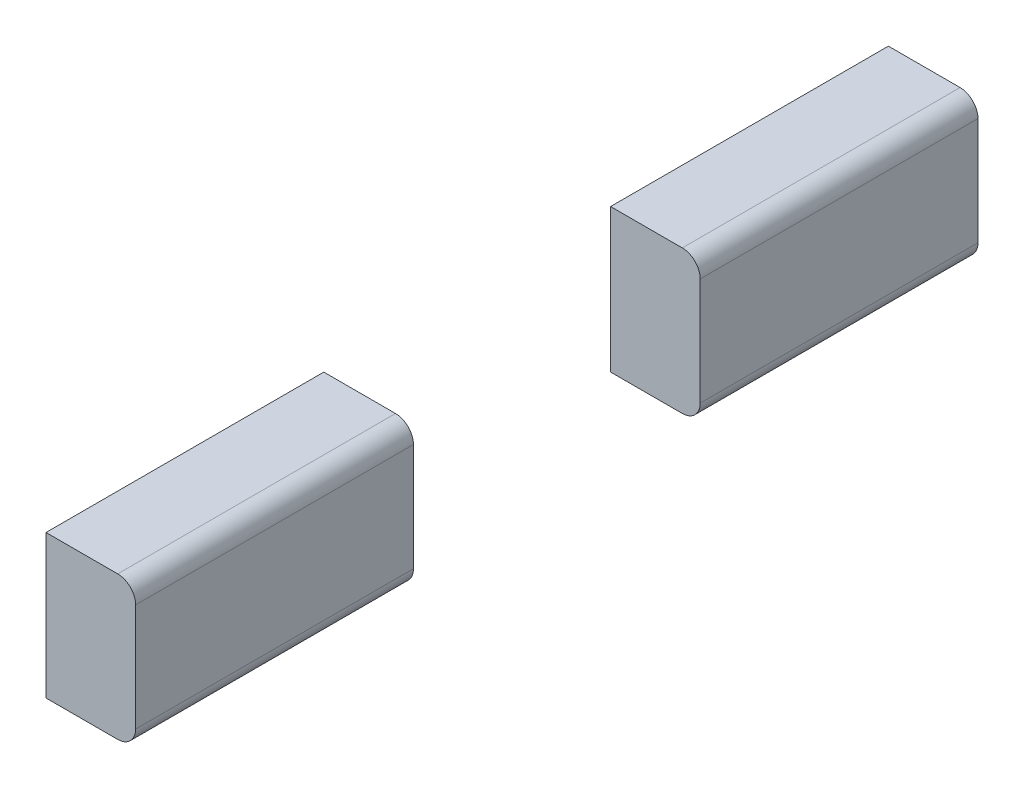
ISO-10303-21;
HEADER;
FILE_DESCRIPTION(('STEP AP214'),'2;1');
FILE_NAME('part.step','',(''),(''),'','','');
FILE_SCHEMA(('AUTOMOTIVE_DESIGN { 1 0 10303 214 1 1 1 1 }'));
ENDSEC;
DATA;
#1=APPLICATION_CONTEXT('core data for automotive mechanical design processes');
#2=APPLICATION_PROTOCOL_DEFINITION('international standard','automotive_design',2000,#1);
#3=PRODUCT_CONTEXT('',#1,'mechanical');
#4=PRODUCT('Part','Part','',(#3));
#5=PRODUCT_RELATED_PRODUCT_CATEGORY('part','',(#4));
#6=PRODUCT_DEFINITION_FORMATION('','',#4);
#7=PRODUCT_DEFINITION_CONTEXT('part definition',#1,'design');
#8=PRODUCT_DEFINITION('design','',#6,#7);
#9=PRODUCT_DEFINITION_SHAPE('','',#8);
#10=(LENGTH_UNIT() NAMED_UNIT(*) SI_UNIT(.MILLI.,.METRE.));
#11=(NAMED_UNIT(*) PLANE_ANGLE_UNIT() SI_UNIT($,.RADIAN.));
#12=(NAMED_UNIT(*) SI_UNIT($,.STERADIAN.) SOLID_ANGLE_UNIT());
#13=UNCERTAINTY_MEASURE_WITH_UNIT(LENGTH_MEASURE(1.E-05),#10,'distance_accuracy_value','');
#14=(GEOMETRIC_REPRESENTATION_CONTEXT(3) GLOBAL_UNCERTAINTY_ASSIGNED_CONTEXT((#13)) GLOBAL_UNIT_ASSIGNED_CONTEXT((#10,
#11,#12)) REPRESENTATION_CONTEXT('',''));
#15=CARTESIAN_POINT('',(0.,0.,0.));
#16=DIRECTION('',(0.,0.,1.));
#17=DIRECTION('',(1.,0.,0.));
#18=AXIS2_PLACEMENT_3D('',#15,#16,#17);
#19=CARTESIAN_POINT('',(63.5,0.,596.9));
#20=DIRECTION('',(0.,1.,0.));
#21=DIRECTION('',(0.,0.,1.));
#22=AXIS2_PLACEMENT_3D('',#19,#20,#21);
#23=PLANE('',#22);
#24=DIRECTION('',(0.,0.,-1.));
#25=VECTOR('',#24,1.);
#26=CARTESIAN_POINT('',(0.,0.,596.9));
#27=LINE('',#26,#25);
#28=CARTESIAN_POINT('',(0.,0.,596.9));
#29=VERTEX_POINT('',#28);
#30=CARTESIAN_POINT('',(0.,0.,400.05));
#31=VERTEX_POINT('',#30);
#32=EDGE_CURVE('E49',#29,#31,#27,.T.);
#33=ORIENTED_EDGE('',*,*,#32,.T.);
#34=DIRECTION('',(1.,0.,0.));
#35=VECTOR('',#34,1.);
#36=CARTESIAN_POINT('',(0.,0.,400.05));
#37=LINE('',#36,#35);
#38=CARTESIAN_POINT('',(50.8,0.,400.05));
#39=VERTEX_POINT('',#38);
#40=EDGE_CURVE('E78',#31,#39,#37,.T.);
#41=ORIENTED_EDGE('',*,*,#40,.T.);
#42=DIRECTION('',(0.,0.,-1.));
#43=VECTOR('',#42,1.);
#44=CARTESIAN_POINT('',(50.8,0.,596.9));
#45=LINE('',#44,#43);
#46=CARTESIAN_POINT('',(50.8,0.,596.9));
#47=VERTEX_POINT('',#46);
#48=EDGE_CURVE('E130',#39,#47,#45,.F.);
#49=ORIENTED_EDGE('',*,*,#48,.T.);
#50=DIRECTION('',(1.,0.,0.));
#51=VECTOR('',#50,1.);
#52=CARTESIAN_POINT('',(63.5,0.,596.9));
#53=LINE('',#52,#51);
#54=EDGE_CURVE('E147',#29,#47,#53,.T.);
#55=ORIENTED_EDGE('',*,*,#54,.F.);
#56=EDGE_LOOP('',(#33,#41,#49,#55));
#57=FACE_BOUND('',#56,.T.);
#58=ADVANCED_FACE('F46',(#57),#23,.F.);
#59=CARTESIAN_POINT('',(63.5,101.6,596.9));
#60=DIRECTION('',(-1.,0.,0.));
#61=DIRECTION('',(0.,0.,1.));
#62=AXIS2_PLACEMENT_3D('',#59,#60,#61);
#63=PLANE('',#62);
#64=DIRECTION('',(0.,0.,-1.));
#65=VECTOR('',#64,1.);
#66=CARTESIAN_POINT('',(63.5,12.7,596.9));
#67=LINE('',#66,#65);
#68=CARTESIAN_POINT('',(63.5,12.7,596.9));
#69=VERTEX_POINT('',#68);
#70=CARTESIAN_POINT('',(63.5,12.7,400.05));
#71=VERTEX_POINT('',#70);
#72=EDGE_CURVE('E126',#69,#71,#67,.T.);
#73=ORIENTED_EDGE('',*,*,#72,.T.);
#74=DIRECTION('',(0.,-1.,0.));
#75=VECTOR('',#74,1.);
#76=CARTESIAN_POINT('',(63.5,101.6,400.05));
#77=LINE('',#76,#75);
#78=CARTESIAN_POINT('',(63.5,88.9,400.05));
#79=VERTEX_POINT('',#78);
#80=EDGE_CURVE('E12',#79,#71,#77,.T.);
#81=ORIENTED_EDGE('',*,*,#80,.F.);
#82=DIRECTION('',(0.,0.,-1.));
#83=VECTOR('',#82,1.);
#84=CARTESIAN_POINT('',(63.5,88.9,596.9));
#85=LINE('',#84,#83);
#86=CARTESIAN_POINT('',(63.5,88.9,596.9));
#87=VERTEX_POINT('',#86);
#88=EDGE_CURVE('E124',#79,#87,#85,.F.);
#89=ORIENTED_EDGE('',*,*,#88,.T.);
#90=DIRECTION('',(0.,1.,0.));
#91=VECTOR('',#90,1.);
#92=CARTESIAN_POINT('',(63.5,101.6,596.9));
#93=LINE('',#92,#91);
#94=EDGE_CURVE('E110',#69,#87,#93,.T.);
#95=ORIENTED_EDGE('',*,*,#94,.F.);
#96=EDGE_LOOP('',(#73,#81,#89,#95));
#97=FACE_BOUND('',#96,.T.);
#98=ADVANCED_FACE('F135',(#97),#63,.F.);
#99=CARTESIAN_POINT('',(0.,101.6,596.9));
#100=DIRECTION('',(0.,-1.,0.));
#101=DIRECTION('',(0.,0.,-1.));
#102=AXIS2_PLACEMENT_3D('',#99,#100,#101);
#103=PLANE('',#102);
#104=DIRECTION('',(0.,0.,-1.));
#105=VECTOR('',#104,1.);
#106=CARTESIAN_POINT('',(50.8,101.6,596.9));
#107=LINE('',#106,#105);
#108=CARTESIAN_POINT('',(50.8,101.6,596.9));
#109=VERTEX_POINT('',#108);
#110=CARTESIAN_POINT('',(50.8,101.6,400.05));
#111=VERTEX_POINT('',#110);
#112=EDGE_CURVE('E118',#109,#111,#107,.T.);
#113=ORIENTED_EDGE('',*,*,#112,.T.);
#114=DIRECTION('',(1.,0.,0.));
#115=VECTOR('',#114,1.);
#116=CARTESIAN_POINT('',(0.,101.6,400.05));
#117=LINE('',#116,#115);
#118=CARTESIAN_POINT('',(0.,101.6,400.05));
#119=VERTEX_POINT('',#118);
#120=EDGE_CURVE('E141',#119,#111,#117,.T.);
#121=ORIENTED_EDGE('',*,*,#120,.F.);
#122=DIRECTION('',(0.,0.,-1.));
#123=VECTOR('',#122,1.);
#124=CARTESIAN_POINT('',(0.,101.6,596.9));
#125=LINE('',#124,#123);
#126=CARTESIAN_POINT('',(0.,101.6,596.9));
#127=VERTEX_POINT('',#126);
#128=EDGE_CURVE('E120',#127,#119,#125,.T.);
#129=ORIENTED_EDGE('',*,*,#128,.F.);
#130=DIRECTION('',(-1.,0.,0.));
#131=VECTOR('',#130,1.);
#132=CARTESIAN_POINT('',(0.,101.6,596.9));
#133=LINE('',#132,#131);
#134=EDGE_CURVE('E107',#109,#127,#133,.T.);
#135=ORIENTED_EDGE('',*,*,#134,.F.);
#136=EDGE_LOOP('',(#113,#121,#129,#135));
#137=FACE_BOUND('',#136,.T.);
#138=ADVANCED_FACE('F117',(#137),#103,.F.);
#139=CARTESIAN_POINT('',(0.,0.,596.9));
#140=DIRECTION('',(1.,0.,0.));
#141=DIRECTION('',(0.,0.,-1.));
#142=AXIS2_PLACEMENT_3D('',#139,#140,#141);
#143=PLANE('',#142);
#144=ORIENTED_EDGE('',*,*,#128,.T.);
#145=DIRECTION('',(0.,-1.,0.));
#146=VECTOR('',#145,1.);
#147=CARTESIAN_POINT('',(0.,101.6,400.05));
#148=LINE('',#147,#146);
#149=EDGE_CURVE('E74',#119,#31,#148,.T.);
#150=ORIENTED_EDGE('',*,*,#149,.T.);
#151=ORIENTED_EDGE('',*,*,#32,.F.);
#152=DIRECTION('',(0.,-1.,0.));
#153=VECTOR('',#152,1.);
#154=CARTESIAN_POINT('',(0.,0.,596.9));
#155=LINE('',#154,#153);
#156=EDGE_CURVE('E88',#127,#29,#155,.T.);
#157=ORIENTED_EDGE('',*,*,#156,.F.);
#158=EDGE_LOOP('',(#144,#150,#151,#157));
#159=FACE_BOUND('',#158,.T.);
#160=ADVANCED_FACE('F153',(#159),#143,.F.);
#161=CARTESIAN_POINT('',(50.8,12.7,596.9));
#162=DIRECTION('',(0.,0.,-1.));
#163=DIRECTION('',(-1.,0.,0.));
#164=AXIS2_PLACEMENT_3D('',#161,#162,#163);
#165=CYLINDRICAL_SURFACE('',#164,12.7);
#166=CARTESIAN_POINT('',(50.8,12.7,400.05));
#167=DIRECTION('',(0.,0.,1.));
#168=DIRECTION('',(1.,0.,0.));
#169=AXIS2_PLACEMENT_3D('',#166,#167,#168);
#170=CIRCLE('',#169,12.7);
#171=EDGE_CURVE('E80',#71,#39,#170,.F.);
#172=ORIENTED_EDGE('',*,*,#171,.F.);
#173=ORIENTED_EDGE('',*,*,#72,.F.);
#174=CARTESIAN_POINT('',(50.8,12.7,596.9));
#175=DIRECTION('',(0.,0.,-1.));
#176=DIRECTION('',(-1.,0.,0.));
#177=AXIS2_PLACEMENT_3D('',#174,#175,#176);
#178=CIRCLE('',#177,12.7);
#179=EDGE_CURVE('E140',#47,#69,#178,.F.);
#180=ORIENTED_EDGE('',*,*,#179,.F.);
#181=ORIENTED_EDGE('',*,*,#48,.F.);
#182=EDGE_LOOP('',(#172,#173,#180,#181));
#183=FACE_BOUND('',#182,.T.);
#184=ADVANCED_FACE('F138',(#183),#165,.T.);
#185=CARTESIAN_POINT('',(50.8,88.9,596.9));
#186=DIRECTION('',(0.,0.,-1.));
#187=DIRECTION('',(-1.,0.,0.));
#188=AXIS2_PLACEMENT_3D('',#185,#186,#187);
#189=CYLINDRICAL_SURFACE('',#188,12.7);
#190=CARTESIAN_POINT('',(50.8,88.9,400.05));
#191=DIRECTION('',(0.,0.,1.));
#192=DIRECTION('',(1.,0.,0.));
#193=AXIS2_PLACEMENT_3D('',#190,#191,#192);
#194=CIRCLE('',#193,12.7);
#195=EDGE_CURVE('E55',#111,#79,#194,.F.);
#196=ORIENTED_EDGE('',*,*,#195,.F.);
#197=ORIENTED_EDGE('',*,*,#112,.F.);
#198=CARTESIAN_POINT('',(50.8,88.9,596.9));
#199=DIRECTION('',(0.,0.,-1.));
#200=DIRECTION('',(-1.,0.,0.));
#201=AXIS2_PLACEMENT_3D('',#198,#199,#200);
#202=CIRCLE('',#201,12.7);
#203=EDGE_CURVE('E104',#87,#109,#202,.F.);
#204=ORIENTED_EDGE('',*,*,#203,.F.);
#205=ORIENTED_EDGE('',*,*,#88,.F.);
#206=EDGE_LOOP('',(#196,#197,#204,#205));
#207=FACE_BOUND('',#206,.T.);
#208=ADVANCED_FACE('F123',(#207),#189,.T.);
#209=CARTESIAN_POINT('',(0.,0.,596.9));
#210=DIRECTION('',(0.,0.,-1.));
#211=DIRECTION('',(-1.,0.,0.));
#212=AXIS2_PLACEMENT_3D('',#209,#210,#211);
#213=PLANE('',#212);
#214=ORIENTED_EDGE('',*,*,#54,.T.);
#215=ORIENTED_EDGE('',*,*,#179,.T.);
#216=ORIENTED_EDGE('',*,*,#94,.T.);
#217=ORIENTED_EDGE('',*,*,#203,.T.);
#218=ORIENTED_EDGE('',*,*,#134,.T.);
#219=ORIENTED_EDGE('',*,*,#156,.T.);
#220=EDGE_LOOP('',(#214,#215,#216,#217,#218,#219));
#221=FACE_BOUND('',#220,.T.);
#222=ADVANCED_FACE('F106',(#221),#213,.F.);
#223=CARTESIAN_POINT('',(0.,101.6,400.05));
#224=DIRECTION('',(0.,0.,1.));
#225=DIRECTION('',(1.,0.,0.));
#226=AXIS2_PLACEMENT_3D('',#223,#224,#225);
#227=PLANE('',#226);
#228=ORIENTED_EDGE('',*,*,#171,.T.);
#229=ORIENTED_EDGE('',*,*,#40,.F.);
#230=ORIENTED_EDGE('',*,*,#149,.F.);
#231=ORIENTED_EDGE('',*,*,#120,.T.);
#232=ORIENTED_EDGE('',*,*,#195,.T.);
#233=ORIENTED_EDGE('',*,*,#80,.T.);
#234=EDGE_LOOP('',(#228,#229,#230,#231,#232,#233));
#235=FACE_BOUND('',#234,.T.);
#236=ADVANCED_FACE('F156',(#235),#227,.F.);
#237=CLOSED_SHELL('',(#58,#98,#138,#160,#184,#208,#222,#236));
#238=MANIFOLD_SOLID_BREP('B2',#237);
#239=CARTESIAN_POINT('',(0.,0.,0.));
#240=DIRECTION('',(0.,0.,-1.));
#241=DIRECTION('',(-1.,0.,0.));
#242=AXIS2_PLACEMENT_3D('',#239,#240,#241);
#243=PLANE('',#242);
#244=DIRECTION('',(0.,1.,0.));
#245=VECTOR('',#244,1.);
#246=CARTESIAN_POINT('',(63.5,101.6,0.));
#247=LINE('',#246,#245);
#248=CARTESIAN_POINT('',(63.5,12.7,0.));
#249=VERTEX_POINT('',#248);
#250=CARTESIAN_POINT('',(63.5,88.9,0.));
#251=VERTEX_POINT('',#250);
#252=EDGE_CURVE('E317',#249,#251,#247,.T.);
#253=ORIENTED_EDGE('',*,*,#252,.F.);
#254=CARTESIAN_POINT('',(50.8,12.7,0.));
#255=DIRECTION('',(0.,0.,-1.));
#256=DIRECTION('',(-1.,0.,0.));
#257=AXIS2_PLACEMENT_3D('',#254,#255,#256);
#258=CIRCLE('',#257,12.7);
#259=CARTESIAN_POINT('',(50.8,0.,0.));
#260=VERTEX_POINT('',#259);
#261=EDGE_CURVE('E310',#249,#260,#258,.T.);
#262=ORIENTED_EDGE('',*,*,#261,.T.);
#263=DIRECTION('',(1.,0.,0.));
#264=VECTOR('',#263,1.);
#265=CARTESIAN_POINT('',(63.5,0.,0.));
#266=LINE('',#265,#264);
#267=CARTESIAN_POINT('',(0.,0.,0.));
#268=VERTEX_POINT('',#267);
#269=EDGE_CURVE('E315',#268,#260,#266,.T.);
#270=ORIENTED_EDGE('',*,*,#269,.F.);
#271=DIRECTION('',(0.,-1.,0.));
#272=VECTOR('',#271,1.);
#273=CARTESIAN_POINT('',(0.,0.,0.));
#274=LINE('',#273,#272);
#275=CARTESIAN_POINT('',(0.,101.6,0.));
#276=VERTEX_POINT('',#275);
#277=EDGE_CURVE('E294',#276,#268,#274,.T.);
#278=ORIENTED_EDGE('',*,*,#277,.F.);
#279=DIRECTION('',(-1.,0.,0.));
#280=VECTOR('',#279,1.);
#281=CARTESIAN_POINT('',(0.,101.6,0.));
#282=LINE('',#281,#280);
#283=CARTESIAN_POINT('',(50.8,101.6,0.));
#284=VERTEX_POINT('',#283);
#285=EDGE_CURVE('E300',#284,#276,#282,.T.);
#286=ORIENTED_EDGE('',*,*,#285,.F.);
#287=CARTESIAN_POINT('',(50.8,88.9,0.));
#288=DIRECTION('',(0.,0.,-1.));
#289=DIRECTION('',(-1.,0.,0.));
#290=AXIS2_PLACEMENT_3D('',#287,#288,#289);
#291=CIRCLE('',#290,12.7);
#292=EDGE_CURVE('E308',#284,#251,#291,.T.);
#293=ORIENTED_EDGE('',*,*,#292,.T.);
#294=EDGE_LOOP('',(#253,#262,#270,#278,#286,#293));
#295=FACE_BOUND('',#294,.T.);
#296=ADVANCED_FACE('F222',(#295),#243,.T.);
#297=CARTESIAN_POINT('',(50.8,12.7,596.9));
#298=DIRECTION('',(0.,0.,-1.));
#299=DIRECTION('',(-1.,0.,0.));
#300=AXIS2_PLACEMENT_3D('',#297,#298,#299);
#301=CYLINDRICAL_SURFACE('',#300,12.7);
#302=CARTESIAN_POINT('',(50.8,12.7,196.85));
#303=DIRECTION('',(0.,0.,-1.));
#304=DIRECTION('',(-1.,0.,0.));
#305=AXIS2_PLACEMENT_3D('',#302,#303,#304);
#306=CIRCLE('',#305,12.7);
#307=CARTESIAN_POINT('',(50.8,0.,196.85));
#308=VERTEX_POINT('',#307);
#309=CARTESIAN_POINT('',(63.5,12.7,196.85));
#310=VERTEX_POINT('',#309);
#311=EDGE_CURVE('E320',#308,#310,#306,.F.);
#312=ORIENTED_EDGE('',*,*,#311,.F.);
#313=DIRECTION('',(0.,0.,-1.));
#314=VECTOR('',#313,1.);
#315=CARTESIAN_POINT('',(50.8,0.,596.9));
#316=LINE('',#315,#314);
#317=EDGE_CURVE('E290',#260,#308,#316,.F.);
#318=ORIENTED_EDGE('',*,*,#317,.F.);
#319=ORIENTED_EDGE('',*,*,#261,.F.);
#320=DIRECTION('',(0.,0.,-1.));
#321=VECTOR('',#320,1.);
#322=CARTESIAN_POINT('',(63.5,12.7,596.9));
#323=LINE('',#322,#321);
#324=EDGE_CURVE('E306',#310,#249,#323,.T.);
#325=ORIENTED_EDGE('',*,*,#324,.F.);
#326=EDGE_LOOP('',(#312,#318,#319,#325));
#327=FACE_BOUND('',#326,.T.);
#328=ADVANCED_FACE('F322',(#327),#301,.T.);
#329=CARTESIAN_POINT('',(50.8,88.9,596.9));
#330=DIRECTION('',(0.,0.,-1.));
#331=DIRECTION('',(-1.,0.,0.));
#332=AXIS2_PLACEMENT_3D('',#329,#330,#331);
#333=CYLINDRICAL_SURFACE('',#332,12.7);
#334=CARTESIAN_POINT('',(50.8,88.9,196.85));
#335=DIRECTION('',(0.,0.,-1.));
#336=DIRECTION('',(-1.,0.,0.));
#337=AXIS2_PLACEMENT_3D('',#334,#335,#336);
#338=CIRCLE('',#337,12.7);
#339=CARTESIAN_POINT('',(63.5,88.9,196.85));
#340=VERTEX_POINT('',#339);
#341=CARTESIAN_POINT('',(50.8,101.6,196.85));
#342=VERTEX_POINT('',#341);
#343=EDGE_CURVE('E44',#340,#342,#338,.F.);
#344=ORIENTED_EDGE('',*,*,#343,.F.);
#345=DIRECTION('',(0.,0.,-1.));
#346=VECTOR('',#345,1.);
#347=CARTESIAN_POINT('',(63.5,88.9,596.9));
#348=LINE('',#347,#346);
#349=EDGE_CURVE('E298',#251,#340,#348,.F.);
#350=ORIENTED_EDGE('',*,*,#349,.F.);
#351=ORIENTED_EDGE('',*,*,#292,.F.);
#352=DIRECTION('',(0.,0.,-1.));
#353=VECTOR('',#352,1.);
#354=CARTESIAN_POINT('',(50.8,101.6,596.9));
#355=LINE('',#354,#353);
#356=EDGE_CURVE('E230',#342,#284,#355,.T.);
#357=ORIENTED_EDGE('',*,*,#356,.F.);
#358=EDGE_LOOP('',(#344,#350,#351,#357));
#359=FACE_BOUND('',#358,.T.);
#360=ADVANCED_FACE('F224',(#359),#333,.T.);
#361=CARTESIAN_POINT('',(0.,0.,596.9));
#362=DIRECTION('',(1.,0.,0.));
#363=DIRECTION('',(0.,0.,-1.));
#364=AXIS2_PLACEMENT_3D('',#361,#362,#363);
#365=PLANE('',#364);
#366=DIRECTION('',(0.,0.,-1.));
#367=VECTOR('',#366,1.);
#368=CARTESIAN_POINT('',(0.,0.,596.9));
#369=LINE('',#368,#367);
#370=CARTESIAN_POINT('',(0.,0.,196.85));
#371=VERTEX_POINT('',#370);
#372=EDGE_CURVE('E287',#371,#268,#369,.T.);
#373=ORIENTED_EDGE('',*,*,#372,.F.);
#374=DIRECTION('',(0.,1.,0.));
#375=VECTOR('',#374,1.);
#376=CARTESIAN_POINT('',(0.,101.6,196.85));
#377=LINE('',#376,#375);
#378=CARTESIAN_POINT('',(0.,101.6,196.85));
#379=VERTEX_POINT('',#378);
#380=EDGE_CURVE('E273',#371,#379,#377,.T.);
#381=ORIENTED_EDGE('',*,*,#380,.T.);
#382=DIRECTION('',(0.,0.,-1.));
#383=VECTOR('',#382,1.);
#384=CARTESIAN_POINT('',(0.,101.6,596.9));
#385=LINE('',#384,#383);
#386=EDGE_CURVE('E296',#379,#276,#385,.T.);
#387=ORIENTED_EDGE('',*,*,#386,.T.);
#388=ORIENTED_EDGE('',*,*,#277,.T.);
#389=EDGE_LOOP('',(#373,#381,#387,#388));
#390=FACE_BOUND('',#389,.T.);
#391=ADVANCED_FACE('F292',(#390),#365,.F.);
#392=CARTESIAN_POINT('',(0.,101.6,596.9));
#393=DIRECTION('',(0.,-1.,0.));
#394=DIRECTION('',(0.,0.,-1.));
#395=AXIS2_PLACEMENT_3D('',#392,#393,#394);
#396=PLANE('',#395);
#397=ORIENTED_EDGE('',*,*,#386,.F.);
#398=DIRECTION('',(1.,0.,0.));
#399=VECTOR('',#398,1.);
#400=CARTESIAN_POINT('',(0.,101.6,196.85));
#401=LINE('',#400,#399);
#402=EDGE_CURVE('E278',#379,#342,#401,.T.);
#403=ORIENTED_EDGE('',*,*,#402,.T.);
#404=ORIENTED_EDGE('',*,*,#356,.T.);
#405=ORIENTED_EDGE('',*,*,#285,.T.);
#406=EDGE_LOOP('',(#397,#403,#404,#405));
#407=FACE_BOUND('',#406,.T.);
#408=ADVANCED_FACE('F327',(#407),#396,.F.);
#409=CARTESIAN_POINT('',(63.5,101.6,596.9));
#410=DIRECTION('',(-1.,0.,0.));
#411=DIRECTION('',(0.,0.,1.));
#412=AXIS2_PLACEMENT_3D('',#409,#410,#411);
#413=PLANE('',#412);
#414=ORIENTED_EDGE('',*,*,#349,.T.);
#415=DIRECTION('',(0.,1.,0.));
#416=VECTOR('',#415,1.);
#417=CARTESIAN_POINT('',(63.5,101.6,196.85));
#418=LINE('',#417,#416);
#419=EDGE_CURVE('E236',#310,#340,#418,.T.);
#420=ORIENTED_EDGE('',*,*,#419,.F.);
#421=ORIENTED_EDGE('',*,*,#324,.T.);
#422=ORIENTED_EDGE('',*,*,#252,.T.);
#423=EDGE_LOOP('',(#414,#420,#421,#422));
#424=FACE_BOUND('',#423,.T.);
#425=ADVANCED_FACE('F331',(#424),#413,.F.);
#426=CARTESIAN_POINT('',(63.5,0.,596.9));
#427=DIRECTION('',(0.,1.,0.));
#428=DIRECTION('',(0.,0.,1.));
#429=AXIS2_PLACEMENT_3D('',#426,#427,#428);
#430=PLANE('',#429);
#431=ORIENTED_EDGE('',*,*,#317,.T.);
#432=DIRECTION('',(1.,0.,0.));
#433=VECTOR('',#432,1.);
#434=CARTESIAN_POINT('',(0.,0.,196.85));
#435=LINE('',#434,#433);
#436=EDGE_CURVE('E276',#371,#308,#435,.T.);
#437=ORIENTED_EDGE('',*,*,#436,.F.);
#438=ORIENTED_EDGE('',*,*,#372,.T.);
#439=ORIENTED_EDGE('',*,*,#269,.T.);
#440=EDGE_LOOP('',(#431,#437,#438,#439));
#441=FACE_BOUND('',#440,.T.);
#442=ADVANCED_FACE('F285',(#441),#430,.F.);
#443=CARTESIAN_POINT('',(0.,101.6,196.85));
#444=DIRECTION('',(0.,0.,-1.));
#445=DIRECTION('',(-1.,0.,0.));
#446=AXIS2_PLACEMENT_3D('',#443,#444,#445);
#447=PLANE('',#446);
#448=ORIENTED_EDGE('',*,*,#311,.T.);
#449=ORIENTED_EDGE('',*,*,#419,.T.);
#450=ORIENTED_EDGE('',*,*,#343,.T.);
#451=ORIENTED_EDGE('',*,*,#402,.F.);
#452=ORIENTED_EDGE('',*,*,#380,.F.);
#453=ORIENTED_EDGE('',*,*,#436,.T.);
#454=EDGE_LOOP('',(#448,#449,#450,#451,#452,#453));
#455=FACE_BOUND('',#454,.T.);
#456=ADVANCED_FACE('F275',(#455),#447,.F.);
#457=CLOSED_SHELL('',(#296,#328,#360,#391,#408,#425,#442,#456));
#458=MANIFOLD_SOLID_BREP('B6',#457);
#459=ADVANCED_BREP_SHAPE_REPRESENTATION('',(#18,#238,#458),#14);
#460=SHAPE_DEFINITION_REPRESENTATION(#9,#459);
ENDSEC;
END-ISO-10303-21;
